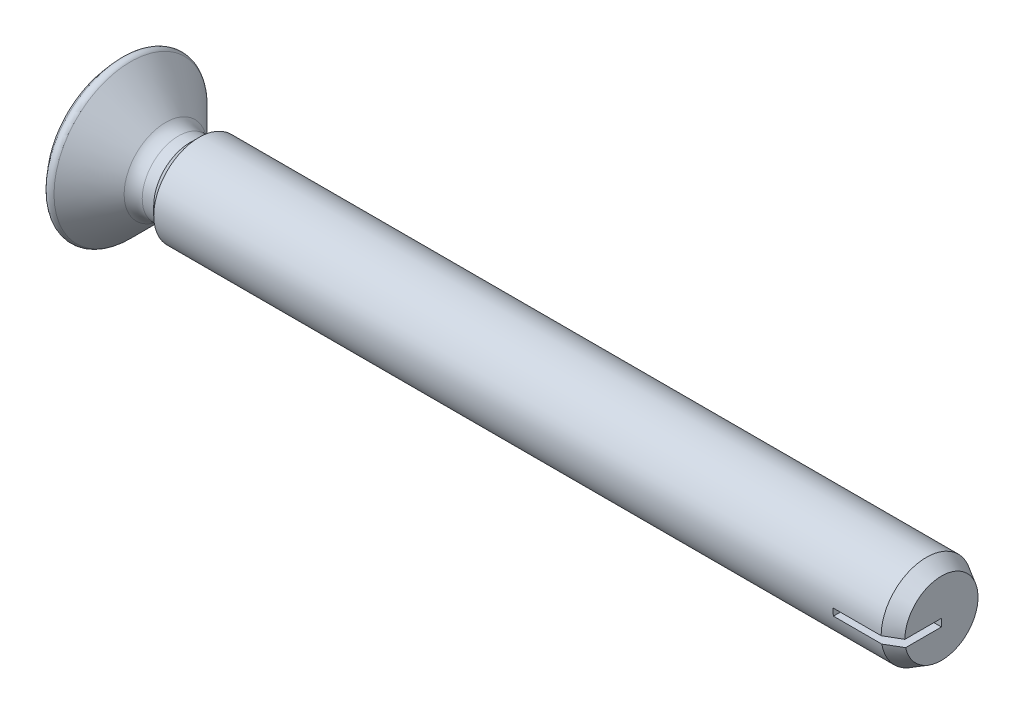
ISO-10303-21;
HEADER;
FILE_DESCRIPTION(('STEP AP214'),'2;1');
FILE_NAME('part.step','',(''),(''),'','','');
FILE_SCHEMA(('AUTOMOTIVE_DESIGN { 1 0 10303 214 1 1 1 1 }'));
ENDSEC;
DATA;
#1=APPLICATION_CONTEXT('core data for automotive mechanical design processes');
#2=APPLICATION_PROTOCOL_DEFINITION('international standard','automotive_design',2000,#1);
#3=PRODUCT_CONTEXT('',#1,'mechanical');
#4=PRODUCT('Part','Part','',(#3));
#5=PRODUCT_RELATED_PRODUCT_CATEGORY('part','',(#4));
#6=PRODUCT_DEFINITION_FORMATION('','',#4);
#7=PRODUCT_DEFINITION_CONTEXT('part definition',#1,'design');
#8=PRODUCT_DEFINITION('design','',#6,#7);
#9=PRODUCT_DEFINITION_SHAPE('','',#8);
#10=(LENGTH_UNIT() NAMED_UNIT(*) SI_UNIT(.MILLI.,.METRE.));
#11=(NAMED_UNIT(*) PLANE_ANGLE_UNIT() SI_UNIT($,.RADIAN.));
#12=(NAMED_UNIT(*) SI_UNIT($,.STERADIAN.) SOLID_ANGLE_UNIT());
#13=UNCERTAINTY_MEASURE_WITH_UNIT(LENGTH_MEASURE(1.E-05),#10,'distance_accuracy_value','');
#14=(GEOMETRIC_REPRESENTATION_CONTEXT(3) GLOBAL_UNCERTAINTY_ASSIGNED_CONTEXT((#13)) GLOBAL_UNIT_ASSIGNED_CONTEXT((#10,
#11,#12)) REPRESENTATION_CONTEXT('',''));
#15=CARTESIAN_POINT('',(0.,0.,0.));
#16=DIRECTION('',(0.,0.,1.));
#17=DIRECTION('',(1.,0.,0.));
#18=AXIS2_PLACEMENT_3D('',#15,#16,#17);
#19=CARTESIAN_POINT('',(0.,0.,0.));
#20=DIRECTION('',(-1.,0.,0.));
#21=DIRECTION('',(0.,0.,1.));
#22=AXIS2_PLACEMENT_3D('',#19,#20,#21);
#23=CYLINDRICAL_SURFACE('',#22,5.00000000000001);
#24=CARTESIAN_POINT('',(7.99999999999999,0.,0.));
#25=DIRECTION('',(-1.,0.,0.));
#26=DIRECTION('',(0.,0.,1.));
#27=AXIS2_PLACEMENT_3D('',#24,#25,#26);
#28=CIRCLE('',#27,5.);
#29=CARTESIAN_POINT('',(7.99999999999999,0.,5.));
#30=VERTEX_POINT('',#29);
#31=EDGE_CURVE('E305',#30,#30,#28,.T.);
#32=ORIENTED_EDGE('',*,*,#31,.F.);
#33=EDGE_LOOP('',(#32));
#34=FACE_BOUND('',#33,.T.);
#35=DIRECTION('',(-1.,0.,0.));
#36=VECTOR('',#35,1.);
#37=CARTESIAN_POINT('',(0.,0.,5.00000000000001));
#38=LINE('',#37,#36);
#39=CARTESIAN_POINT('',(88.3372312247338,0.,5.));
#40=VERTEX_POINT('',#39);
#41=CARTESIAN_POINT('',(83.,0.,5.00000000000001));
#42=VERTEX_POINT('',#41);
#43=EDGE_CURVE('E377',#40,#42,#38,.T.);
#44=ORIENTED_EDGE('',*,*,#43,.F.);
#45=CARTESIAN_POINT('',(88.3372312247338,0.,0.));
#46=DIRECTION('',(-1.,0.,0.));
#47=DIRECTION('',(0.,0.,1.));
#48=AXIS2_PLACEMENT_3D('',#45,#46,#47);
#49=CIRCLE('',#48,5.);
#50=CARTESIAN_POINT('',(88.3372312247338,-0.833333333333333,4.93006648591635));
#51=VERTEX_POINT('',#50);
#52=EDGE_CURVE('E374',#40,#51,#49,.T.);
#53=ORIENTED_EDGE('',*,*,#52,.T.);
#54=DIRECTION('',(-1.,0.,0.));
#55=VECTOR('',#54,1.);
#56=CARTESIAN_POINT('',(0.,-0.833333333333344,4.93006648591635));
#57=LINE('',#56,#55);
#58=CARTESIAN_POINT('',(83.,-0.833333333333334,4.93006648591635));
#59=VERTEX_POINT('',#58);
#60=EDGE_CURVE('E381',#59,#51,#57,.F.);
#61=ORIENTED_EDGE('',*,*,#60,.F.);
#62=CARTESIAN_POINT('',(83.,0.,0.));
#63=DIRECTION('',(1.,0.,0.));
#64=DIRECTION('',(0.,0.,-1.));
#65=AXIS2_PLACEMENT_3D('',#62,#63,#64);
#66=CIRCLE('',#65,5.00000000000001);
#67=EDGE_CURVE('E43',#42,#59,#66,.T.);
#68=ORIENTED_EDGE('',*,*,#67,.F.);
#69=EDGE_LOOP('',(#44,#53,#61,#68));
#70=FACE_BOUND('',#69,.T.);
#71=ADVANCED_FACE('F70',(#34,#70),#23,.T.);
#72=CARTESIAN_POINT('',(88.3372312247338,0.,0.));
#73=DIRECTION('',(-1.,0.,0.));
#74=DIRECTION('',(0.,0.,1.));
#75=AXIS2_PLACEMENT_3D('',#72,#73,#74);
#76=CONICAL_SURFACE('',#75,5.,0.523598775598288);
#77=ORIENTED_EDGE('',*,*,#52,.F.);
#78=DIRECTION('',(-0.866025403784444,0.,0.499999999999991));
#79=VECTOR('',#78,1.);
#80=CARTESIAN_POINT('',(96.9974852625784,0.,0.));
#81=LINE('',#80,#79);
#82=CARTESIAN_POINT('',(90.,0.,4.04));
#83=VERTEX_POINT('',#82);
#84=EDGE_CURVE('E379',#40,#83,#81,.F.);
#85=ORIENTED_EDGE('',*,*,#84,.T.);
#86=CARTESIAN_POINT('',(90.,0.,0.));
#87=DIRECTION('',(-1.,0.,0.));
#88=DIRECTION('',(0.,0.,1.));
#89=AXIS2_PLACEMENT_3D('',#86,#87,#88);
#90=CIRCLE('',#89,4.04);
#91=CARTESIAN_POINT('',(90.,-0.833333333333333,3.95311972441457));
#92=VERTEX_POINT('',#91);
#93=EDGE_CURVE('E232',#83,#92,#90,.T.);
#94=ORIENTED_EDGE('',*,*,#93,.T.);
#95=CARTESIAN_POINT('',(94.324763961956,-0.833333333333332,1.29873089558839));
#96=CARTESIAN_POINT('',(94.2539941704602,-0.833333333333332,1.34725537138208));
#97=CARTESIAN_POINT('',(94.1828785114112,-0.833333333333332,1.39526964887627));
#98=CARTESIAN_POINT('',(94.0401016315832,-0.833333333333332,1.4904734470094));
#99=CARTESIAN_POINT('',(93.9684404371539,-0.833333333333333,1.53766300712431));
#100=CARTESIAN_POINT('',(93.8247211543456,-0.833333333333333,1.63141155391444));
#101=CARTESIAN_POINT('',(93.752663118618,-0.833333333333333,1.67797062153482));
#102=CARTESIAN_POINT('',(93.6082258623107,-0.833333333333333,1.77058968692907));
#103=CARTESIAN_POINT('',(93.5358466372734,-0.833333333333333,1.81664967774572));
#104=CARTESIAN_POINT('',(93.3183642112331,-0.833333333333333,1.95421200872292));
#105=CARTESIAN_POINT('',(93.1728838142965,-0.833333333333333,2.04511773162647));
#106=CARTESIAN_POINT('',(92.8812495364593,-0.833333333333333,2.22585256137804));
#107=CARTESIAN_POINT('',(92.7350956278255,-0.833333333333333,2.31568162333399));
#108=CARTESIAN_POINT('',(92.3080852699756,-0.833333333333333,2.57660770394161));
#109=CARTESIAN_POINT('',(92.026608833395,-0.833333333333333,2.74668927298443));
#110=CARTESIAN_POINT('',(91.4627141115084,-0.833333333333333,3.08527145364159));
#111=CARTESIAN_POINT('',(91.1802958355546,-0.833333333333333,3.25377208089117));
#112=CARTESIAN_POINT('',(90.6148051769543,-0.833333333333333,3.58980112792525));
#113=CARTESIAN_POINT('',(90.3317326746539,-0.833333333333333,3.7573293462797));
#114=CARTESIAN_POINT('',(89.7651904009645,-0.833333333333333,4.09171283682867));
#115=CARTESIAN_POINT('',(89.4817206290751,-0.833333333333333,4.25856810817449));
#116=CARTESIAN_POINT('',(88.7666378111783,-0.833333333333333,4.67868104235534));
#117=CARTESIAN_POINT('',(88.3348433243252,-0.833333333333333,4.93162979117258));
#118=CARTESIAN_POINT('',(87.4708588506733,-0.833333333333333,5.43685048612454));
#119=CARTESIAN_POINT('',(87.038668863839,-0.833333333333333,5.68912243219863));
#120=CARTESIAN_POINT('',(86.174190792108,-0.833333333333334,6.19311639762206));
#121=CARTESIAN_POINT('',(85.7419028086198,-0.833333333333334,6.44483859095239));
#122=CARTESIAN_POINT('',(84.8771371202499,-0.833333333333334,6.94795546546832));
#123=CARTESIAN_POINT('',(84.4446594156462,-0.833333333333334,7.19935014713158));
#124=CARTESIAN_POINT('',(84.0121233168639,-0.833333333333334,7.45064407792753));
#125=B_SPLINE_CURVE_WITH_KNOTS('',3,(#95,#96,#97,#98,#99,#100,#101,#102,#103,#104,#105,#106,
#107,#108,#109,#110,#111,#112,#113,#114,#115,#116,#117,#118,#119,#120,#121,#122,#123,#124),
.UNSPECIFIED.,.F.,.F.,(4,2,2,2,2,2,2,2,2,2,2,2,2,2,4),(0.,0.257416666427786,0.514820977404491,
0.772191922352451,1.02956645049409,1.54419953035658,2.05885399404564,3.0454582885905,
4.03205281546698,5.01884489709276,6.00563822283813,7.506925166367,9.00821224437489,
10.5089227938863,12.0096311523225),.UNSPECIFIED.);
#126=EDGE_CURVE('E383',#92,#51,#125,.T.);
#127=ORIENTED_EDGE('',*,*,#126,.T.);
#128=EDGE_LOOP('',(#77,#85,#94,#127));
#129=FACE_BOUND('',#128,.T.);
#130=ADVANCED_FACE('F393',(#129),#76,.T.);
#131=CARTESIAN_POINT('',(90.,5.00000000000002,0.));
#132=DIRECTION('',(-1.,0.,0.));
#133=DIRECTION('',(0.,0.,1.));
#134=AXIS2_PLACEMENT_3D('',#131,#132,#133);
#135=PLANE('',#134);
#136=DIRECTION('',(0.,0.,1.));
#137=VECTOR('',#136,1.);
#138=CARTESIAN_POINT('',(90.,0.,0.));
#139=LINE('',#138,#137);
#140=CARTESIAN_POINT('',(90.,0.,0.));
#141=VERTEX_POINT('',#140);
#142=EDGE_CURVE('E78',#141,#83,#139,.T.);
#143=ORIENTED_EDGE('',*,*,#142,.F.);
#144=DIRECTION('',(0.,1.,0.));
#145=VECTOR('',#144,1.);
#146=CARTESIAN_POINT('',(90.,0.,0.));
#147=LINE('',#146,#145);
#148=CARTESIAN_POINT('',(90.,-0.833333333333334,0.));
#149=VERTEX_POINT('',#148);
#150=EDGE_CURVE('E222',#149,#141,#147,.T.);
#151=ORIENTED_EDGE('',*,*,#150,.F.);
#152=DIRECTION('',(0.,0.,-1.));
#153=VECTOR('',#152,1.);
#154=CARTESIAN_POINT('',(90.,-0.833333333333333,0.));
#155=LINE('',#154,#153);
#156=EDGE_CURVE('E233',#92,#149,#155,.T.);
#157=ORIENTED_EDGE('',*,*,#156,.F.);
#158=ORIENTED_EDGE('',*,*,#93,.F.);
#159=EDGE_LOOP('',(#143,#151,#157,#158));
#160=FACE_BOUND('',#159,.T.);
#161=ADVANCED_FACE('F230',(#160),#135,.F.);
#162=CARTESIAN_POINT('',(8.45228331927532,0.,0.));
#163=DIRECTION('',(-1.,0.,0.));
#164=DIRECTION('',(0.,1.,0.));
#165=AXIS2_PLACEMENT_3D('',#162,#163,#164);
#166=SPHERICAL_SURFACE('',#165,12.2740007051205);
#167=CARTESIAN_POINT('',(-0.453487574451341,0.,0.));
#168=DIRECTION('',(-1.,0.,0.));
#169=DIRECTION('',(0.,0.,1.));
#170=AXIS2_PLACEMENT_3D('',#167,#168,#169);
#171=CIRCLE('',#170,8.44620258446071);
#172=CARTESIAN_POINT('',(-0.453487574451341,0.,8.44620258446071));
#173=VERTEX_POINT('',#172);
#174=EDGE_CURVE('E270',#173,#173,#171,.T.);
#175=ORIENTED_EDGE('',*,*,#174,.T.);
#176=EDGE_LOOP('',(#175));
#177=FACE_BOUND('',#176,.T.);
#178=CARTESIAN_POINT('',(8.45228331927532,-0.99,0.));
#179=DIRECTION('',(0.,1.,0.));
#180=DIRECTION('',(0.,0.,1.));
#181=AXIS2_PLACEMENT_3D('',#178,#179,#180);
#182=CIRCLE('',#181,12.2340096987578);
#183=CARTESIAN_POINT('',(-3.62076556281324,-0.99,1.978));
#184=VERTEX_POINT('',#183);
#185=CARTESIAN_POINT('',(-2.88444746433884,-0.99,4.59886164709865));
#186=VERTEX_POINT('',#185);
#187=EDGE_CURVE('E266',#184,#186,#182,.T.);
#188=ORIENTED_EDGE('',*,*,#187,.F.);
#189=CARTESIAN_POINT('',(8.45228331927532,-1.484,1.484));
#190=DIRECTION('',(0.,-0.707106781186548,0.707106781186548));
#191=DIRECTION('',(0.,-0.707106781186548,-0.707106781186548));
#192=AXIS2_PLACEMENT_3D('',#189,#190,#191);
#193=CIRCLE('',#192,12.0932452761573);
#194=CARTESIAN_POINT('',(-3.62076556281324,-1.978,0.99));
#195=VERTEX_POINT('',#194);
#196=EDGE_CURVE('E361',#184,#195,#193,.T.);
#197=ORIENTED_EDGE('',*,*,#196,.T.);
#198=CARTESIAN_POINT('',(8.45228331927532,0.,0.989999999999999));
#199=DIRECTION('',(0.,0.,-1.));
#200=DIRECTION('',(0.,1.,0.));
#201=AXIS2_PLACEMENT_3D('',#198,#199,#200);
#202=CIRCLE('',#201,12.2340096987578);
#203=CARTESIAN_POINT('',(-2.88444746433884,-4.59886164709865,0.99));
#204=VERTEX_POINT('',#203);
#205=EDGE_CURVE('E251',#204,#195,#202,.T.);
#206=ORIENTED_EDGE('',*,*,#205,.F.);
#207=CARTESIAN_POINT('',(8.6041833801388,-0.417341987236199,0.));
#208=DIRECTION('',(-0.342020143325669,0.939692620785908,0.));
#209=DIRECTION('',(-0.939692620785908,-0.342020143325669,0.));
#210=AXIS2_PLACEMENT_3D('',#207,#208,#209);
#211=CIRCLE('',#210,12.2659628788978);
#212=CARTESIAN_POINT('',(-2.88444746433884,-4.59886164709865,-0.99));
#213=VERTEX_POINT('',#212);
#214=EDGE_CURVE('E249',#213,#204,#211,.T.);
#215=ORIENTED_EDGE('',*,*,#214,.F.);
#216=CARTESIAN_POINT('',(8.45228331927532,0.,-0.99));
#217=DIRECTION('',(0.,0.,1.));
#218=DIRECTION('',(0.,-1.,0.));
#219=AXIS2_PLACEMENT_3D('',#216,#217,#218);
#220=CIRCLE('',#219,12.2340096987578);
#221=CARTESIAN_POINT('',(-3.62076556281324,-1.978,-0.99));
#222=VERTEX_POINT('',#221);
#223=EDGE_CURVE('E252',#222,#213,#220,.T.);
#224=ORIENTED_EDGE('',*,*,#223,.F.);
#225=CARTESIAN_POINT('',(8.45228331927532,-1.484,-1.484));
#226=DIRECTION('',(0.,-0.707106781186548,-0.707106781186548));
#227=DIRECTION('',(0.,0.707106781186548,-0.707106781186548));
#228=AXIS2_PLACEMENT_3D('',#225,#226,#227);
#229=CIRCLE('',#228,12.0932452761573);
#230=CARTESIAN_POINT('',(-3.62076556281324,-0.99,-1.978));
#231=VERTEX_POINT('',#230);
#232=EDGE_CURVE('E352',#222,#231,#229,.T.);
#233=ORIENTED_EDGE('',*,*,#232,.T.);
#234=CARTESIAN_POINT('',(8.45228331927532,-0.99,0.));
#235=DIRECTION('',(0.,1.,0.));
#236=DIRECTION('',(0.,0.,1.));
#237=AXIS2_PLACEMENT_3D('',#234,#235,#236);
#238=CIRCLE('',#237,12.2340096987578);
#239=CARTESIAN_POINT('',(-2.88444746433884,-0.99,-4.59886164709865));
#240=VERTEX_POINT('',#239);
#241=EDGE_CURVE('E291',#240,#231,#238,.T.);
#242=ORIENTED_EDGE('',*,*,#241,.F.);
#243=CARTESIAN_POINT('',(8.6041833801388,0.,-0.417341987236199));
#244=DIRECTION('',(-0.342020143325669,0.,0.939692620785908));
#245=DIRECTION('',(0.939692620785908,0.,0.342020143325669));
#246=AXIS2_PLACEMENT_3D('',#243,#244,#245);
#247=CIRCLE('',#246,12.2659628788978);
#248=CARTESIAN_POINT('',(-2.88444746433884,0.99,-4.59886164709865));
#249=VERTEX_POINT('',#248);
#250=EDGE_CURVE('E289',#249,#240,#247,.T.);
#251=ORIENTED_EDGE('',*,*,#250,.F.);
#252=CARTESIAN_POINT('',(8.45228331927532,0.99,0.));
#253=DIRECTION('',(0.,-1.,0.));
#254=DIRECTION('',(0.,0.,-1.));
#255=AXIS2_PLACEMENT_3D('',#252,#253,#254);
#256=CIRCLE('',#255,12.2340096987578);
#257=CARTESIAN_POINT('',(-3.62076556281324,0.99,-1.978));
#258=VERTEX_POINT('',#257);
#259=EDGE_CURVE('E292',#258,#249,#256,.T.);
#260=ORIENTED_EDGE('',*,*,#259,.F.);
#261=CARTESIAN_POINT('',(8.45228331927532,1.484,-1.484));
#262=DIRECTION('',(0.,0.707106781186547,-0.707106781186548));
#263=DIRECTION('',(0.,0.707106781186548,0.707106781186547));
#264=AXIS2_PLACEMENT_3D('',#261,#262,#263);
#265=CIRCLE('',#264,12.0932452761573);
#266=CARTESIAN_POINT('',(-3.62076556281324,1.978,-0.99));
#267=VERTEX_POINT('',#266);
#268=EDGE_CURVE('E341',#258,#267,#265,.T.);
#269=ORIENTED_EDGE('',*,*,#268,.T.);
#270=CARTESIAN_POINT('',(8.45228331927532,0.,-0.99));
#271=DIRECTION('',(0.,0.,1.));
#272=DIRECTION('',(0.,-1.,0.));
#273=AXIS2_PLACEMENT_3D('',#270,#271,#272);
#274=CIRCLE('',#273,12.2340096987578);
#275=CARTESIAN_POINT('',(-2.88444746433884,4.59886164709865,-0.99));
#276=VERTEX_POINT('',#275);
#277=EDGE_CURVE('E234',#276,#267,#274,.T.);
#278=ORIENTED_EDGE('',*,*,#277,.F.);
#279=CARTESIAN_POINT('',(8.6041833801388,0.417341987236199,0.));
#280=DIRECTION('',(-0.342020143325669,-0.939692620785908,0.));
#281=DIRECTION('',(0.939692620785908,-0.342020143325669,0.));
#282=AXIS2_PLACEMENT_3D('',#279,#280,#281);
#283=CIRCLE('',#282,12.2659628788978);
#284=CARTESIAN_POINT('',(-2.88444746433884,4.59886164709865,0.99));
#285=VERTEX_POINT('',#284);
#286=EDGE_CURVE('E277',#285,#276,#283,.T.);
#287=ORIENTED_EDGE('',*,*,#286,.F.);
#288=CARTESIAN_POINT('',(8.45228331927532,0.,0.989999999999999));
#289=DIRECTION('',(0.,0.,-1.));
#290=DIRECTION('',(0.,1.,0.));
#291=AXIS2_PLACEMENT_3D('',#288,#289,#290);
#292=CIRCLE('',#291,12.2340096987578);
#293=CARTESIAN_POINT('',(-3.62076556281324,1.978,0.99));
#294=VERTEX_POINT('',#293);
#295=EDGE_CURVE('E279',#294,#285,#292,.T.);
#296=ORIENTED_EDGE('',*,*,#295,.F.);
#297=CARTESIAN_POINT('',(8.45228331927532,1.484,1.484));
#298=DIRECTION('',(0.,0.707106781186547,0.707106781186548));
#299=DIRECTION('',(0.,-0.707106781186548,0.707106781186547));
#300=AXIS2_PLACEMENT_3D('',#297,#298,#299);
#301=CIRCLE('',#300,12.0932452761573);
#302=CARTESIAN_POINT('',(-3.62076556281324,0.99,1.978));
#303=VERTEX_POINT('',#302);
#304=EDGE_CURVE('E334',#294,#303,#301,.T.);
#305=ORIENTED_EDGE('',*,*,#304,.T.);
#306=CARTESIAN_POINT('',(8.45228331927532,0.99,0.));
#307=DIRECTION('',(0.,-1.,0.));
#308=DIRECTION('',(0.,0.,-1.));
#309=AXIS2_PLACEMENT_3D('',#306,#307,#308);
#310=CIRCLE('',#309,12.2340096987578);
#311=CARTESIAN_POINT('',(-2.88444746433884,0.99,4.59886164709865));
#312=VERTEX_POINT('',#311);
#313=EDGE_CURVE('E265',#312,#303,#310,.T.);
#314=ORIENTED_EDGE('',*,*,#313,.F.);
#315=CARTESIAN_POINT('',(8.6041833801388,0.,0.417341987236199));
#316=DIRECTION('',(-0.342020143325669,0.,-0.939692620785908));
#317=DIRECTION('',(-0.939692620785908,0.,0.342020143325669));
#318=AXIS2_PLACEMENT_3D('',#315,#316,#317);
#319=CIRCLE('',#318,12.2659628788978);
#320=EDGE_CURVE('E263',#186,#312,#319,.T.);
#321=ORIENTED_EDGE('',*,*,#320,.F.);
#322=EDGE_LOOP('',(#188,#197,#206,#215,#224,#233,#242,#251,#260,#269,#278,#287,#296,#305,#314,#321));
#323=FACE_BOUND('',#322,.T.);
#324=ADVANCED_FACE('F425',(#177,#323),#166,.T.);
#325=CARTESIAN_POINT('',(7.99999999999999,0.,0.));
#326=DIRECTION('',(1.,0.,0.));
#327=DIRECTION('',(0.,0.,-1.));
#328=AXIS2_PLACEMENT_3D('',#325,#326,#327);
#329=CONICAL_SURFACE('',#328,5.,0.785398163397443);
#330=CARTESIAN_POINT('',(6.99999999999998,0.,0.));
#331=DIRECTION('',(-1.,0.,0.));
#332=DIRECTION('',(0.,0.,1.));
#333=AXIS2_PLACEMENT_3D('',#330,#331,#332);
#334=CIRCLE('',#333,4.);
#335=CARTESIAN_POINT('',(6.99999999999998,0.,4.));
#336=VERTEX_POINT('',#335);
#337=EDGE_CURVE('E308',#336,#336,#334,.T.);
#338=ORIENTED_EDGE('',*,*,#337,.F.);
#339=EDGE_LOOP('',(#338));
#340=FACE_BOUND('',#339,.T.);
#341=ORIENTED_EDGE('',*,*,#31,.T.);
#342=EDGE_LOOP('',(#341));
#343=FACE_BOUND('',#342,.T.);
#344=ADVANCED_FACE('F421',(#340,#343),#329,.T.);
#345=CARTESIAN_POINT('',(0.,0.,0.));
#346=DIRECTION('',(-1.,0.,0.));
#347=DIRECTION('',(0.,0.,1.));
#348=AXIS2_PLACEMENT_3D('',#345,#346,#347);
#349=CYLINDRICAL_SURFACE('',#348,4.);
#350=CARTESIAN_POINT('',(5.72842712474618,0.,0.));
#351=DIRECTION('',(-1.,0.,0.));
#352=DIRECTION('',(0.,0.,1.));
#353=AXIS2_PLACEMENT_3D('',#350,#351,#352);
#354=CIRCLE('',#353,3.99999999999999);
#355=CARTESIAN_POINT('',(5.72842712474618,0.,3.99999999999999));
#356=VERTEX_POINT('',#355);
#357=EDGE_CURVE('E311',#356,#356,#354,.T.);
#358=ORIENTED_EDGE('',*,*,#357,.F.);
#359=EDGE_LOOP('',(#358));
#360=FACE_BOUND('',#359,.T.);
#361=ORIENTED_EDGE('',*,*,#337,.T.);
#362=EDGE_LOOP('',(#361));
#363=FACE_BOUND('',#362,.T.);
#364=ADVANCED_FACE('F526',(#360,#363),#349,.T.);
#365=CARTESIAN_POINT('',(5.72842712474618,0.,0.));
#366=DIRECTION('',(-1.,0.,0.));
#367=DIRECTION('',(0.,0.,1.));
#368=AXIS2_PLACEMENT_3D('',#365,#366,#367);
#369=TOROIDAL_SURFACE('',#368,6.,2.);
#370=CARTESIAN_POINT('',(4.31421356237308,0.,0.));
#371=DIRECTION('',(-1.,0.,0.));
#372=DIRECTION('',(0.,0.,1.));
#373=AXIS2_PLACEMENT_3D('',#370,#371,#372);
#374=CIRCLE('',#373,4.5857864376269);
#375=CARTESIAN_POINT('',(4.31421356237308,0.,4.5857864376269));
#376=VERTEX_POINT('',#375);
#377=EDGE_CURVE('E314',#376,#376,#374,.T.);
#378=ORIENTED_EDGE('',*,*,#377,.F.);
#379=EDGE_LOOP('',(#378));
#380=FACE_BOUND('',#379,.T.);
#381=ORIENTED_EDGE('',*,*,#357,.T.);
#382=EDGE_LOOP('',(#381));
#383=FACE_BOUND('',#382,.T.);
#384=ADVANCED_FACE('F523',(#380,#383),#369,.F.);
#385=CARTESIAN_POINT('',(4.31421356237308,0.,0.));
#386=DIRECTION('',(-1.,0.,0.));
#387=DIRECTION('',(0.,0.,1.));
#388=AXIS2_PLACEMENT_3D('',#385,#386,#387);
#389=CONICAL_SURFACE('',#388,4.5857864376269,0.78539816339745);
#390=CARTESIAN_POINT('',(0.441941738241592,0.,0.));
#391=DIRECTION('',(-1.,0.,0.));
#392=DIRECTION('',(0.,0.,1.));
#393=AXIS2_PLACEMENT_3D('',#390,#391,#392);
#394=CIRCLE('',#393,8.4580582617584);
#395=CARTESIAN_POINT('',(0.441941738241592,0.,8.4580582617584));
#396=VERTEX_POINT('',#395);
#397=EDGE_CURVE('E317',#396,#396,#394,.T.);
#398=ORIENTED_EDGE('',*,*,#397,.F.);
#399=EDGE_LOOP('',(#398));
#400=FACE_BOUND('',#399,.T.);
#401=ORIENTED_EDGE('',*,*,#377,.T.);
#402=EDGE_LOOP('',(#401));
#403=FACE_BOUND('',#402,.T.);
#404=ADVANCED_FACE('F517',(#400,#403),#389,.T.);
#405=CARTESIAN_POINT('',(0.,0.,0.));
#406=DIRECTION('',(-1.,0.,0.));
#407=DIRECTION('',(0.,0.,1.));
#408=AXIS2_PLACEMENT_3D('',#405,#406,#407);
#409=TOROIDAL_SURFACE('',#408,8.01611652351681,0.624999999999999);
#410=ORIENTED_EDGE('',*,*,#174,.F.);
#411=EDGE_LOOP('',(#410));
#412=FACE_BOUND('',#411,.T.);
#413=ORIENTED_EDGE('',*,*,#397,.T.);
#414=EDGE_LOOP('',(#413));
#415=FACE_BOUND('',#414,.T.);
#416=ADVANCED_FACE('F512',(#412,#415),#409,.T.);
#417=CARTESIAN_POINT('',(-1.32171738584523,4.94,-0.99));
#418=DIRECTION('',(0.,0.,1.));
#419=DIRECTION('',(0.,-1.,0.));
#420=AXIS2_PLACEMENT_3D('',#417,#418,#419);
#421=PLANE('',#420);
#422=DIRECTION('',(-1.,0.,0.));
#423=VECTOR('',#422,1.);
#424=CARTESIAN_POINT('',(0.0755256137793849,1.978,-0.99));
#425=LINE('',#424,#423);
#426=CARTESIAN_POINT('',(-1.32171738584523,1.978,-0.99));
#427=VERTEX_POINT('',#426);
#428=EDGE_CURVE('E350',#427,#267,#425,.T.);
#429=ORIENTED_EDGE('',*,*,#428,.F.);
#430=DIRECTION('',(0.,1.,0.));
#431=VECTOR('',#430,1.);
#432=CARTESIAN_POINT('',(-1.32171738584523,4.94,-0.99));
#433=LINE('',#432,#431);
#434=CARTESIAN_POINT('',(-1.32171738584523,4.03007441433449,-0.99));
#435=VERTEX_POINT('',#434);
#436=EDGE_CURVE('E274',#427,#435,#433,.T.);
#437=ORIENTED_EDGE('',*,*,#436,.T.);
#438=DIRECTION('',(-0.939692620785908,0.342020143325669,0.));
#439=VECTOR('',#438,1.);
#440=CARTESIAN_POINT('',(-3.82171738584523,4.94,-0.99));
#441=LINE('',#440,#439);
#442=EDGE_CURVE('E267',#435,#276,#441,.T.);
#443=ORIENTED_EDGE('',*,*,#442,.T.);
#444=ORIENTED_EDGE('',*,*,#277,.T.);
#445=EDGE_LOOP('',(#429,#437,#443,#444));
#446=FACE_BOUND('',#445,.T.);
#447=ADVANCED_FACE('F504',(#446),#421,.T.);
#448=CARTESIAN_POINT('',(-3.82171738584523,4.94,0.));
#449=DIRECTION('',(-0.342020143325669,-0.939692620785908,0.));
#450=DIRECTION('',(0.939692620785908,-0.342020143325669,0.));
#451=AXIS2_PLACEMENT_3D('',#448,#449,#450);
#452=PLANE('',#451);
#453=ORIENTED_EDGE('',*,*,#286,.T.);
#454=ORIENTED_EDGE('',*,*,#442,.F.);
#455=DIRECTION('',(0.,0.,1.));
#456=VECTOR('',#455,1.);
#457=CARTESIAN_POINT('',(-1.32171738584523,4.03007441433449,-0.99));
#458=LINE('',#457,#456);
#459=CARTESIAN_POINT('',(-1.32171738584523,4.03007441433449,0.99));
#460=VERTEX_POINT('',#459);
#461=EDGE_CURVE('E271',#435,#460,#458,.T.);
#462=ORIENTED_EDGE('',*,*,#461,.T.);
#463=DIRECTION('',(-0.939692620785908,0.342020143325669,0.));
#464=VECTOR('',#463,1.);
#465=CARTESIAN_POINT('',(-1.61416183194651,4.13651548789183,0.99));
#466=LINE('',#465,#464);
#467=EDGE_CURVE('E256',#460,#285,#466,.T.);
#468=ORIENTED_EDGE('',*,*,#467,.T.);
#469=EDGE_LOOP('',(#453,#454,#462,#468));
#470=FACE_BOUND('',#469,.T.);
#471=ADVANCED_FACE('F72',(#470),#452,.T.);
#472=CARTESIAN_POINT('',(-1.32171738584523,4.94,0.99));
#473=DIRECTION('',(0.,0.,-1.));
#474=DIRECTION('',(0.,1.,0.));
#475=AXIS2_PLACEMENT_3D('',#472,#473,#474);
#476=PLANE('',#475);
#477=DIRECTION('',(-1.,0.,0.));
#478=VECTOR('',#477,1.);
#479=CARTESIAN_POINT('',(0.0755256137793849,1.978,0.99));
#480=LINE('',#479,#478);
#481=CARTESIAN_POINT('',(-1.32171738584523,1.978,0.99));
#482=VERTEX_POINT('',#481);
#483=EDGE_CURVE('E340',#482,#294,#480,.T.);
#484=ORIENTED_EDGE('',*,*,#483,.T.);
#485=ORIENTED_EDGE('',*,*,#295,.T.);
#486=ORIENTED_EDGE('',*,*,#467,.F.);
#487=DIRECTION('',(0.,-1.,0.));
#488=VECTOR('',#487,1.);
#489=CARTESIAN_POINT('',(-1.32171738584523,4.94,0.99));
#490=LINE('',#489,#488);
#491=EDGE_CURVE('E273',#460,#482,#490,.T.);
#492=ORIENTED_EDGE('',*,*,#491,.T.);
#493=EDGE_LOOP('',(#484,#485,#486,#492));
#494=FACE_BOUND('',#493,.T.);
#495=ADVANCED_FACE('F451',(#494),#476,.T.);
#496=CARTESIAN_POINT('',(-1.32171738584523,0.99,0.99));
#497=DIRECTION('',(0.,-1.,0.));
#498=DIRECTION('',(0.,0.,-1.));
#499=AXIS2_PLACEMENT_3D('',#496,#497,#498);
#500=PLANE('',#499);
#501=DIRECTION('',(-1.,0.,0.));
#502=VECTOR('',#501,1.);
#503=CARTESIAN_POINT('',(0.0755256137793849,0.99,1.978));
#504=LINE('',#503,#502);
#505=CARTESIAN_POINT('',(-1.32171738584523,0.99,1.978));
#506=VERTEX_POINT('',#505);
#507=EDGE_CURVE('E338',#506,#303,#504,.T.);
#508=ORIENTED_EDGE('',*,*,#507,.F.);
#509=DIRECTION('',(0.,0.,1.));
#510=VECTOR('',#509,1.);
#511=CARTESIAN_POINT('',(-1.32171738584523,0.99,0.99));
#512=LINE('',#511,#510);
#513=CARTESIAN_POINT('',(-1.32171738584523,0.99,4.03007441433449));
#514=VERTEX_POINT('',#513);
#515=EDGE_CURVE('E260',#506,#514,#512,.T.);
#516=ORIENTED_EDGE('',*,*,#515,.T.);
#517=DIRECTION('',(-0.939692620785908,0.,0.342020143325669));
#518=VECTOR('',#517,1.);
#519=CARTESIAN_POINT('',(-3.82171738584523,0.99,4.94));
#520=LINE('',#519,#518);
#521=EDGE_CURVE('E253',#514,#312,#520,.T.);
#522=ORIENTED_EDGE('',*,*,#521,.T.);
#523=ORIENTED_EDGE('',*,*,#313,.T.);
#524=EDGE_LOOP('',(#508,#516,#522,#523));
#525=FACE_BOUND('',#524,.T.);
#526=ADVANCED_FACE('F443',(#525),#500,.T.);
#527=CARTESIAN_POINT('',(-3.82171738584523,0.,4.94));
#528=DIRECTION('',(-0.342020143325669,0.,-0.939692620785908));
#529=DIRECTION('',(-0.939692620785908,0.,0.342020143325669));
#530=AXIS2_PLACEMENT_3D('',#527,#528,#529);
#531=PLANE('',#530);
#532=ORIENTED_EDGE('',*,*,#320,.T.);
#533=ORIENTED_EDGE('',*,*,#521,.F.);
#534=DIRECTION('',(0.,-1.,0.));
#535=VECTOR('',#534,1.);
#536=CARTESIAN_POINT('',(-1.32171738584523,0.99,4.03007441433449));
#537=LINE('',#536,#535);
#538=CARTESIAN_POINT('',(-1.32171738584523,-0.99,4.03007441433449));
#539=VERTEX_POINT('',#538);
#540=EDGE_CURVE('E257',#514,#539,#537,.T.);
#541=ORIENTED_EDGE('',*,*,#540,.T.);
#542=DIRECTION('',(-0.939692620785908,0.,0.342020143325669));
#543=VECTOR('',#542,1.);
#544=CARTESIAN_POINT('',(-0.344656302815594,-0.99,3.6744532630518));
#545=LINE('',#544,#543);
#546=EDGE_CURVE('E240',#539,#186,#545,.T.);
#547=ORIENTED_EDGE('',*,*,#546,.T.);
#548=EDGE_LOOP('',(#532,#533,#541,#547));
#549=FACE_BOUND('',#548,.T.);
#550=ADVANCED_FACE('F440',(#549),#531,.T.);
#551=CARTESIAN_POINT('',(-1.32171738584523,-0.99,0.989999999999999));
#552=DIRECTION('',(0.,1.,0.));
#553=DIRECTION('',(0.,0.,1.));
#554=AXIS2_PLACEMENT_3D('',#551,#552,#553);
#555=PLANE('',#554);
#556=DIRECTION('',(-1.,0.,0.));
#557=VECTOR('',#556,1.);
#558=CARTESIAN_POINT('',(0.0755256137793849,-0.99,1.978));
#559=LINE('',#558,#557);
#560=CARTESIAN_POINT('',(-1.32171738584523,-0.99,1.978));
#561=VERTEX_POINT('',#560);
#562=EDGE_CURVE('E368',#561,#184,#559,.T.);
#563=ORIENTED_EDGE('',*,*,#562,.T.);
#564=ORIENTED_EDGE('',*,*,#187,.T.);
#565=ORIENTED_EDGE('',*,*,#546,.F.);
#566=DIRECTION('',(0.,0.,-1.));
#567=VECTOR('',#566,1.);
#568=CARTESIAN_POINT('',(-1.32171738584523,-0.99,0.989999999999999));
#569=LINE('',#568,#567);
#570=EDGE_CURVE('E259',#539,#561,#569,.T.);
#571=ORIENTED_EDGE('',*,*,#570,.T.);
#572=EDGE_LOOP('',(#563,#564,#565,#571));
#573=FACE_BOUND('',#572,.T.);
#574=ADVANCED_FACE('F442',(#573),#555,.T.);
#575=CARTESIAN_POINT('',(-1.32171738584523,-0.99,0.989999999999999));
#576=DIRECTION('',(0.,0.,-1.));
#577=DIRECTION('',(0.,1.,0.));
#578=AXIS2_PLACEMENT_3D('',#575,#576,#577);
#579=PLANE('',#578);
#580=DIRECTION('',(-1.,0.,0.));
#581=VECTOR('',#580,1.);
#582=CARTESIAN_POINT('',(0.0755256137793849,-1.978,0.99));
#583=LINE('',#582,#581);
#584=CARTESIAN_POINT('',(-1.32171738584523,-1.978,0.99));
#585=VERTEX_POINT('',#584);
#586=EDGE_CURVE('E369',#585,#195,#583,.T.);
#587=ORIENTED_EDGE('',*,*,#586,.F.);
#588=DIRECTION('',(0.,-1.,0.));
#589=VECTOR('',#588,1.);
#590=CARTESIAN_POINT('',(-1.32171738584523,-0.99,0.989999999999999));
#591=LINE('',#590,#589);
#592=CARTESIAN_POINT('',(-1.32171738584523,-4.03007441433449,0.99));
#593=VERTEX_POINT('',#592);
#594=EDGE_CURVE('E245',#585,#593,#591,.T.);
#595=ORIENTED_EDGE('',*,*,#594,.T.);
#596=DIRECTION('',(-0.939692620785908,-0.342020143325669,0.));
#597=VECTOR('',#596,1.);
#598=CARTESIAN_POINT('',(-3.82171738584523,-4.94,0.99));
#599=LINE('',#598,#597);
#600=EDGE_CURVE('E237',#593,#204,#599,.T.);
#601=ORIENTED_EDGE('',*,*,#600,.T.);
#602=ORIENTED_EDGE('',*,*,#205,.T.);
#603=EDGE_LOOP('',(#587,#595,#601,#602));
#604=FACE_BOUND('',#603,.T.);
#605=ADVANCED_FACE('F438',(#604),#579,.T.);
#606=CARTESIAN_POINT('',(-3.82171738584523,-4.94,0.));
#607=DIRECTION('',(-0.342020143325669,0.939692620785908,0.));
#608=DIRECTION('',(-0.939692620785908,-0.342020143325669,0.));
#609=AXIS2_PLACEMENT_3D('',#606,#607,#608);
#610=PLANE('',#609);
#611=ORIENTED_EDGE('',*,*,#214,.T.);
#612=ORIENTED_EDGE('',*,*,#600,.F.);
#613=DIRECTION('',(0.,0.,-1.));
#614=VECTOR('',#613,1.);
#615=CARTESIAN_POINT('',(-1.32171738584523,-4.03007441433449,-0.99));
#616=LINE('',#615,#614);
#617=CARTESIAN_POINT('',(-1.32171738584523,-4.03007441433449,-0.99));
#618=VERTEX_POINT('',#617);
#619=EDGE_CURVE('E242',#593,#618,#616,.T.);
#620=ORIENTED_EDGE('',*,*,#619,.T.);
#621=DIRECTION('',(-0.939692620785908,-0.342020143325669,0.));
#622=VECTOR('',#621,1.);
#623=CARTESIAN_POINT('',(-0.344656302815594,-3.6744532630518,-0.99));
#624=LINE('',#623,#622);
#625=EDGE_CURVE('E241',#618,#213,#624,.T.);
#626=ORIENTED_EDGE('',*,*,#625,.T.);
#627=EDGE_LOOP('',(#611,#612,#620,#626));
#628=FACE_BOUND('',#627,.T.);
#629=ADVANCED_FACE('F435',(#628),#610,.T.);
#630=CARTESIAN_POINT('',(-1.32171738584523,-0.99,-0.99));
#631=DIRECTION('',(0.,0.,1.));
#632=DIRECTION('',(0.,-1.,0.));
#633=AXIS2_PLACEMENT_3D('',#630,#631,#632);
#634=PLANE('',#633);
#635=DIRECTION('',(-1.,0.,0.));
#636=VECTOR('',#635,1.);
#637=CARTESIAN_POINT('',(0.0755256137793849,-1.978,-0.99));
#638=LINE('',#637,#636);
#639=CARTESIAN_POINT('',(-1.32171738584523,-1.978,-0.99));
#640=VERTEX_POINT('',#639);
#641=EDGE_CURVE('E360',#640,#222,#638,.T.);
#642=ORIENTED_EDGE('',*,*,#641,.T.);
#643=ORIENTED_EDGE('',*,*,#223,.T.);
#644=ORIENTED_EDGE('',*,*,#625,.F.);
#645=DIRECTION('',(0.,1.,0.));
#646=VECTOR('',#645,1.);
#647=CARTESIAN_POINT('',(-1.32171738584523,-0.99,-0.99));
#648=LINE('',#647,#646);
#649=EDGE_CURVE('E244',#618,#640,#648,.T.);
#650=ORIENTED_EDGE('',*,*,#649,.T.);
#651=EDGE_LOOP('',(#642,#643,#644,#650));
#652=FACE_BOUND('',#651,.T.);
#653=ADVANCED_FACE('F437',(#652),#634,.T.);
#654=CARTESIAN_POINT('',(-1.32171738584523,-0.99,-4.94));
#655=DIRECTION('',(0.,1.,0.));
#656=DIRECTION('',(0.,0.,1.));
#657=AXIS2_PLACEMENT_3D('',#654,#655,#656);
#658=PLANE('',#657);
#659=DIRECTION('',(-1.,0.,0.));
#660=VECTOR('',#659,1.);
#661=CARTESIAN_POINT('',(0.0755256137793849,-0.99,-1.978));
#662=LINE('',#661,#660);
#663=CARTESIAN_POINT('',(-1.32171738584523,-0.99,-1.978));
#664=VERTEX_POINT('',#663);
#665=EDGE_CURVE('E358',#664,#231,#662,.T.);
#666=ORIENTED_EDGE('',*,*,#665,.F.);
#667=DIRECTION('',(0.,0.,-1.));
#668=VECTOR('',#667,1.);
#669=CARTESIAN_POINT('',(-1.32171738584523,-0.99,-4.94));
#670=LINE('',#669,#668);
#671=CARTESIAN_POINT('',(-1.32171738584523,-0.99,-4.03007441433449));
#672=VERTEX_POINT('',#671);
#673=EDGE_CURVE('E286',#664,#672,#670,.T.);
#674=ORIENTED_EDGE('',*,*,#673,.T.);
#675=DIRECTION('',(-0.939692620785908,0.,-0.342020143325669));
#676=VECTOR('',#675,1.);
#677=CARTESIAN_POINT('',(-3.82171738584523,-0.99,-4.94));
#678=LINE('',#677,#676);
#679=EDGE_CURVE('E248',#672,#240,#678,.T.);
#680=ORIENTED_EDGE('',*,*,#679,.T.);
#681=ORIENTED_EDGE('',*,*,#241,.T.);
#682=EDGE_LOOP('',(#666,#674,#680,#681));
#683=FACE_BOUND('',#682,.T.);
#684=ADVANCED_FACE('F433',(#683),#658,.T.);
#685=CARTESIAN_POINT('',(-3.82171738584523,0.,-4.94));
#686=DIRECTION('',(-0.342020143325669,0.,0.939692620785908));
#687=DIRECTION('',(0.939692620785908,0.,0.342020143325669));
#688=AXIS2_PLACEMENT_3D('',#685,#686,#687);
#689=PLANE('',#688);
#690=ORIENTED_EDGE('',*,*,#250,.T.);
#691=ORIENTED_EDGE('',*,*,#679,.F.);
#692=DIRECTION('',(0.,1.,0.));
#693=VECTOR('',#692,1.);
#694=CARTESIAN_POINT('',(-1.32171738584523,0.99,-4.03007441433449));
#695=LINE('',#694,#693);
#696=CARTESIAN_POINT('',(-1.32171738584523,0.99,-4.03007441433449));
#697=VERTEX_POINT('',#696);
#698=EDGE_CURVE('E283',#672,#697,#695,.T.);
#699=ORIENTED_EDGE('',*,*,#698,.T.);
#700=DIRECTION('',(-0.939692620785908,0.,-0.342020143325669));
#701=VECTOR('',#700,1.);
#702=CARTESIAN_POINT('',(-1.61416183194651,0.99,-4.13651548789183));
#703=LINE('',#702,#701);
#704=EDGE_CURVE('E282',#697,#249,#703,.T.);
#705=ORIENTED_EDGE('',*,*,#704,.T.);
#706=EDGE_LOOP('',(#690,#691,#699,#705));
#707=FACE_BOUND('',#706,.T.);
#708=ADVANCED_FACE('F429',(#707),#689,.T.);
#709=CARTESIAN_POINT('',(-1.32171738584523,0.99,-4.94));
#710=DIRECTION('',(0.,-1.,0.));
#711=DIRECTION('',(0.,0.,-1.));
#712=AXIS2_PLACEMENT_3D('',#709,#710,#711);
#713=PLANE('',#712);
#714=DIRECTION('',(-1.,0.,0.));
#715=VECTOR('',#714,1.);
#716=CARTESIAN_POINT('',(0.0755256137793849,0.99,-1.978));
#717=LINE('',#716,#715);
#718=CARTESIAN_POINT('',(-1.32171738584523,0.989999999999999,-1.978));
#719=VERTEX_POINT('',#718);
#720=EDGE_CURVE('E349',#719,#258,#717,.T.);
#721=ORIENTED_EDGE('',*,*,#720,.T.);
#722=ORIENTED_EDGE('',*,*,#259,.T.);
#723=ORIENTED_EDGE('',*,*,#704,.F.);
#724=DIRECTION('',(0.,0.,1.));
#725=VECTOR('',#724,1.);
#726=CARTESIAN_POINT('',(-1.32171738584523,0.99,-4.94));
#727=LINE('',#726,#725);
#728=EDGE_CURVE('E285',#697,#719,#727,.T.);
#729=ORIENTED_EDGE('',*,*,#728,.T.);
#730=EDGE_LOOP('',(#721,#722,#723,#729));
#731=FACE_BOUND('',#730,.T.);
#732=ADVANCED_FACE('F432',(#731),#713,.T.);
#733=CARTESIAN_POINT('',(-1.32171738584523,0.99,-0.99));
#734=DIRECTION('',(-1.,0.,0.));
#735=DIRECTION('',(0.,0.,1.));
#736=AXIS2_PLACEMENT_3D('',#733,#734,#735);
#737=PLANE('',#736);
#738=ORIENTED_EDGE('',*,*,#594,.F.);
#739=DIRECTION('',(0.,-0.707106781186548,-0.707106781186548));
#740=VECTOR('',#739,1.);
#741=CARTESIAN_POINT('',(-1.32171738584523,-1.978,0.99));
#742=LINE('',#741,#740);
#743=EDGE_CURVE('E93',#561,#585,#742,.T.);
#744=ORIENTED_EDGE('',*,*,#743,.F.);
#745=ORIENTED_EDGE('',*,*,#570,.F.);
#746=ORIENTED_EDGE('',*,*,#540,.F.);
#747=ORIENTED_EDGE('',*,*,#515,.F.);
#748=DIRECTION('',(0.,-0.707106781186548,0.707106781186547));
#749=VECTOR('',#748,1.);
#750=CARTESIAN_POINT('',(-1.32171738584523,1.978,0.99));
#751=LINE('',#750,#749);
#752=EDGE_CURVE('E337',#482,#506,#751,.T.);
#753=ORIENTED_EDGE('',*,*,#752,.F.);
#754=ORIENTED_EDGE('',*,*,#491,.F.);
#755=ORIENTED_EDGE('',*,*,#461,.F.);
#756=ORIENTED_EDGE('',*,*,#436,.F.);
#757=DIRECTION('',(0.,0.707106781186548,0.707106781186547));
#758=VECTOR('',#757,1.);
#759=CARTESIAN_POINT('',(-1.32171738584523,1.978,-0.99));
#760=LINE('',#759,#758);
#761=EDGE_CURVE('E347',#719,#427,#760,.T.);
#762=ORIENTED_EDGE('',*,*,#761,.F.);
#763=ORIENTED_EDGE('',*,*,#728,.F.);
#764=ORIENTED_EDGE('',*,*,#698,.F.);
#765=ORIENTED_EDGE('',*,*,#673,.F.);
#766=DIRECTION('',(0.,0.707106781186548,-0.707106781186548));
#767=VECTOR('',#766,1.);
#768=CARTESIAN_POINT('',(-1.32171738584523,-1.978,-0.99));
#769=LINE('',#768,#767);
#770=EDGE_CURVE('E357',#640,#664,#769,.T.);
#771=ORIENTED_EDGE('',*,*,#770,.F.);
#772=ORIENTED_EDGE('',*,*,#649,.F.);
#773=ORIENTED_EDGE('',*,*,#619,.F.);
#774=EDGE_LOOP('',(#738,#744,#745,#746,#747,#753,#754,#755,#756,#762,#763,#764,#765,#771,#772,#773));
#775=FACE_BOUND('',#774,.T.);
#776=ADVANCED_FACE('F472',(#775),#737,.T.);
#777=CARTESIAN_POINT('',(0.0755256137793849,1.978,0.99));
#778=DIRECTION('',(0.,0.707106781186547,0.707106781186548));
#779=DIRECTION('',(0.,-0.707106781186548,0.707106781186547));
#780=AXIS2_PLACEMENT_3D('',#777,#778,#779);
#781=PLANE('',#780);
#782=ORIENTED_EDGE('',*,*,#483,.F.);
#783=ORIENTED_EDGE('',*,*,#752,.T.);
#784=ORIENTED_EDGE('',*,*,#507,.T.);
#785=ORIENTED_EDGE('',*,*,#304,.F.);
#786=EDGE_LOOP('',(#782,#783,#784,#785));
#787=FACE_BOUND('',#786,.T.);
#788=ADVANCED_FACE('F467',(#787),#781,.F.);
#789=CARTESIAN_POINT('',(0.0755256137793849,1.978,-0.99));
#790=DIRECTION('',(0.,0.707106781186547,-0.707106781186548));
#791=DIRECTION('',(0.,0.707106781186548,0.707106781186547));
#792=AXIS2_PLACEMENT_3D('',#789,#790,#791);
#793=PLANE('',#792);
#794=ORIENTED_EDGE('',*,*,#720,.F.);
#795=ORIENTED_EDGE('',*,*,#761,.T.);
#796=ORIENTED_EDGE('',*,*,#428,.T.);
#797=ORIENTED_EDGE('',*,*,#268,.F.);
#798=EDGE_LOOP('',(#794,#795,#796,#797));
#799=FACE_BOUND('',#798,.T.);
#800=ADVANCED_FACE('F579',(#799),#793,.F.);
#801=CARTESIAN_POINT('',(0.0755256137793849,-1.978,-0.99));
#802=DIRECTION('',(0.,-0.707106781186548,-0.707106781186548));
#803=DIRECTION('',(0.,0.707106781186548,-0.707106781186548));
#804=AXIS2_PLACEMENT_3D('',#801,#802,#803);
#805=PLANE('',#804);
#806=ORIENTED_EDGE('',*,*,#641,.F.);
#807=ORIENTED_EDGE('',*,*,#770,.T.);
#808=ORIENTED_EDGE('',*,*,#665,.T.);
#809=ORIENTED_EDGE('',*,*,#232,.F.);
#810=EDGE_LOOP('',(#806,#807,#808,#809));
#811=FACE_BOUND('',#810,.T.);
#812=ADVANCED_FACE('F571',(#811),#805,.F.);
#813=CARTESIAN_POINT('',(0.0755256137793849,-1.978,0.99));
#814=DIRECTION('',(0.,-0.707106781186548,0.707106781186548));
#815=DIRECTION('',(0.,-0.707106781186548,-0.707106781186548));
#816=AXIS2_PLACEMENT_3D('',#813,#814,#815);
#817=PLANE('',#816);
#818=ORIENTED_EDGE('',*,*,#562,.F.);
#819=ORIENTED_EDGE('',*,*,#743,.T.);
#820=ORIENTED_EDGE('',*,*,#586,.T.);
#821=ORIENTED_EDGE('',*,*,#196,.F.);
#822=EDGE_LOOP('',(#818,#819,#820,#821));
#823=FACE_BOUND('',#822,.T.);
#824=ADVANCED_FACE('F405',(#823),#817,.F.);
#825=CARTESIAN_POINT('',(83.,0.,8.64111652351681));
#826=DIRECTION('',(1.,0.,0.));
#827=DIRECTION('',(0.,0.,-1.));
#828=AXIS2_PLACEMENT_3D('',#825,#826,#827);
#829=PLANE('',#828);
#830=ORIENTED_EDGE('',*,*,#67,.T.);
#831=DIRECTION('',(0.,0.,-1.));
#832=VECTOR('',#831,1.);
#833=CARTESIAN_POINT('',(83.,-0.833333333333334,8.64111652351681));
#834=LINE('',#833,#832);
#835=CARTESIAN_POINT('',(83.,-0.833333333333334,0.));
#836=VERTEX_POINT('',#835);
#837=EDGE_CURVE('E742',#59,#836,#834,.T.);
#838=ORIENTED_EDGE('',*,*,#837,.T.);
#839=DIRECTION('',(0.,-1.,0.));
#840=VECTOR('',#839,1.);
#841=CARTESIAN_POINT('',(83.,0.,0.));
#842=LINE('',#841,#840);
#843=CARTESIAN_POINT('',(83.,0.,0.));
#844=VERTEX_POINT('',#843);
#845=EDGE_CURVE('E221',#844,#836,#842,.T.);
#846=ORIENTED_EDGE('',*,*,#845,.F.);
#847=DIRECTION('',(0.,0.,-1.));
#848=VECTOR('',#847,1.);
#849=CARTESIAN_POINT('',(83.,0.,8.64111652351681));
#850=LINE('',#849,#848);
#851=EDGE_CURVE('E219',#42,#844,#850,.T.);
#852=ORIENTED_EDGE('',*,*,#851,.F.);
#853=EDGE_LOOP('',(#830,#838,#846,#852));
#854=FACE_BOUND('',#853,.T.);
#855=ADVANCED_FACE('F403',(#854),#829,.T.);
#856=CARTESIAN_POINT('',(90.,0.,8.64111652351681));
#857=DIRECTION('',(0.,-1.,0.));
#858=DIRECTION('',(1.,0.,0.));
#859=AXIS2_PLACEMENT_3D('',#856,#857,#858);
#860=PLANE('',#859);
#861=ORIENTED_EDGE('',*,*,#43,.T.);
#862=ORIENTED_EDGE('',*,*,#851,.T.);
#863=DIRECTION('',(-1.,0.,0.));
#864=VECTOR('',#863,1.);
#865=CARTESIAN_POINT('',(90.,0.,0.));
#866=LINE('',#865,#864);
#867=EDGE_CURVE('E214',#141,#844,#866,.T.);
#868=ORIENTED_EDGE('',*,*,#867,.F.);
#869=ORIENTED_EDGE('',*,*,#142,.T.);
#870=ORIENTED_EDGE('',*,*,#84,.F.);
#871=EDGE_LOOP('',(#861,#862,#868,#869,#870));
#872=FACE_BOUND('',#871,.T.);
#873=ADVANCED_FACE('F215',(#872),#860,.T.);
#874=CARTESIAN_POINT('',(90.,-0.833333333333333,8.64111652351681));
#875=DIRECTION('',(0.,1.,0.));
#876=DIRECTION('',(-1.,0.,0.));
#877=AXIS2_PLACEMENT_3D('',#874,#875,#876);
#878=PLANE('',#877);
#879=ORIENTED_EDGE('',*,*,#60,.T.);
#880=ORIENTED_EDGE('',*,*,#126,.F.);
#881=ORIENTED_EDGE('',*,*,#156,.T.);
#882=DIRECTION('',(1.,0.,0.));
#883=VECTOR('',#882,1.);
#884=CARTESIAN_POINT('',(90.,-0.833333333333333,0.));
#885=LINE('',#884,#883);
#886=EDGE_CURVE('E85',#836,#149,#885,.T.);
#887=ORIENTED_EDGE('',*,*,#886,.F.);
#888=ORIENTED_EDGE('',*,*,#837,.F.);
#889=EDGE_LOOP('',(#879,#880,#881,#887,#888));
#890=FACE_BOUND('',#889,.T.);
#891=ADVANCED_FACE('F397',(#890),#878,.T.);
#892=CARTESIAN_POINT('',(90.,-0.833333333333333,0.));
#893=DIRECTION('',(0.,0.,-1.));
#894=DIRECTION('',(-1.,0.,0.));
#895=AXIS2_PLACEMENT_3D('',#892,#893,#894);
#896=PLANE('',#895);
#897=ORIENTED_EDGE('',*,*,#150,.T.);
#898=ORIENTED_EDGE('',*,*,#867,.T.);
#899=ORIENTED_EDGE('',*,*,#845,.T.);
#900=ORIENTED_EDGE('',*,*,#886,.T.);
#901=EDGE_LOOP('',(#897,#898,#899,#900));
#902=FACE_BOUND('',#901,.T.);
#903=ADVANCED_FACE('F225',(#902),#896,.F.);
#904=CLOSED_SHELL('',(#71,#130,#161,#324,#344,#364,#384,#404,#416,#447,#471,#495,#526,#550,#574,
#605,#629,#653,#684,#708,#732,#776,#788,#800,#812,#824,#855,#873,#891,#903));
#905=MANIFOLD_SOLID_BREP('B6',#904);
#906=ADVANCED_BREP_SHAPE_REPRESENTATION('',(#18,#905),#14);
#907=SHAPE_DEFINITION_REPRESENTATION(#9,#906);
ENDSEC;
END-ISO-10303-21;
